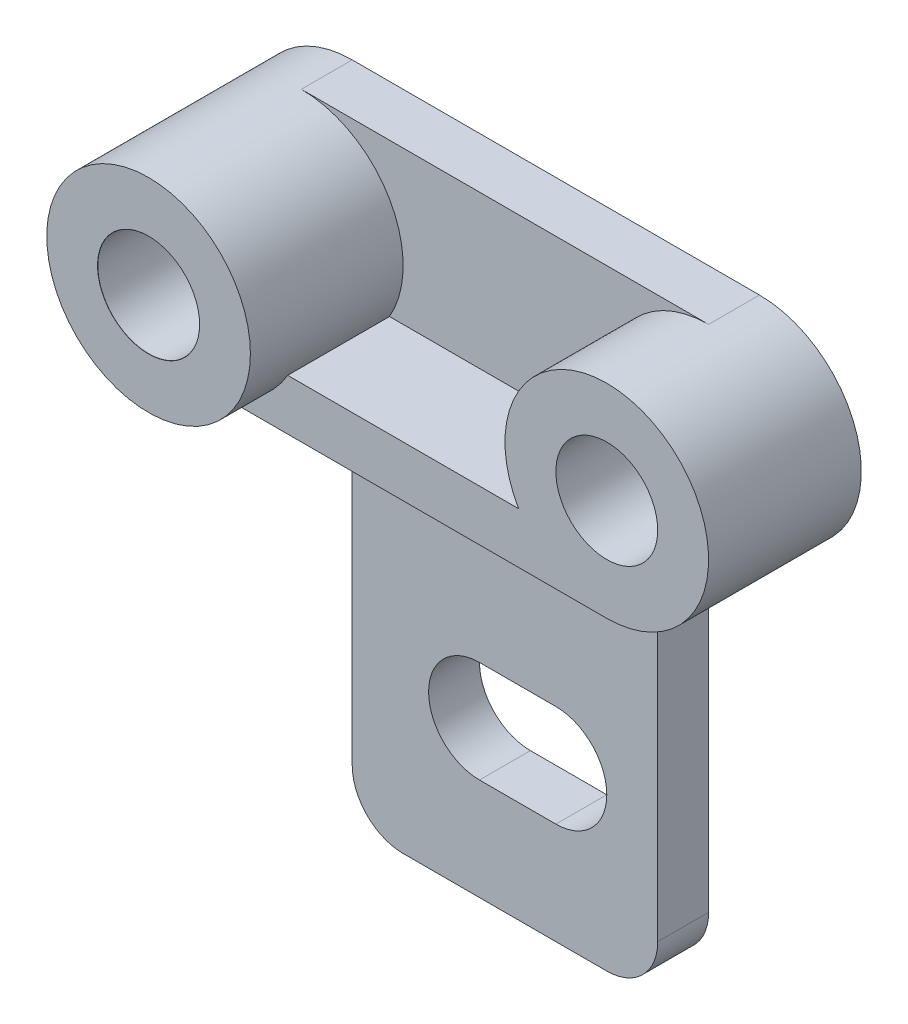
ISO-10303-21;
HEADER;
FILE_DESCRIPTION(('STEP AP214'),'2;1');
FILE_NAME('part.step','',(''),(''),'','','');
FILE_SCHEMA(('AUTOMOTIVE_DESIGN { 1 0 10303 214 1 1 1 1 }'));
ENDSEC;
DATA;
#1=APPLICATION_CONTEXT('core data for automotive mechanical design processes');
#2=APPLICATION_PROTOCOL_DEFINITION('international standard','automotive_design',2000,#1);
#3=PRODUCT_CONTEXT('',#1,'mechanical');
#4=PRODUCT('Part','Part','',(#3));
#5=PRODUCT_RELATED_PRODUCT_CATEGORY('part','',(#4));
#6=PRODUCT_DEFINITION_FORMATION('','',#4);
#7=PRODUCT_DEFINITION_CONTEXT('part definition',#1,'design');
#8=PRODUCT_DEFINITION('design','',#6,#7);
#9=PRODUCT_DEFINITION_SHAPE('','',#8);
#10=(LENGTH_UNIT() NAMED_UNIT(*) SI_UNIT(.MILLI.,.METRE.));
#11=(NAMED_UNIT(*) PLANE_ANGLE_UNIT() SI_UNIT($,.RADIAN.));
#12=(NAMED_UNIT(*) SI_UNIT($,.STERADIAN.) SOLID_ANGLE_UNIT());
#13=UNCERTAINTY_MEASURE_WITH_UNIT(LENGTH_MEASURE(1.E-05),#10,'distance_accuracy_value','');
#14=(GEOMETRIC_REPRESENTATION_CONTEXT(3) GLOBAL_UNCERTAINTY_ASSIGNED_CONTEXT((#13)) GLOBAL_UNIT_ASSIGNED_CONTEXT((#10,
#11,#12)) REPRESENTATION_CONTEXT('',''));
#15=CARTESIAN_POINT('',(0.,0.,0.));
#16=DIRECTION('',(0.,0.,1.));
#17=DIRECTION('',(1.,0.,0.));
#18=AXIS2_PLACEMENT_3D('',#15,#16,#17);
#19=CARTESIAN_POINT('',(-40.,0.,40.));
#20=DIRECTION('',(0.,0.,-1.));
#21=DIRECTION('',(-1.,0.,0.));
#22=AXIS2_PLACEMENT_3D('',#19,#20,#21);
#23=CYLINDRICAL_SURFACE('',#22,20.);
#24=CARTESIAN_POINT('',(-40.,0.,30.));
#25=DIRECTION('',(0.,0.,1.));
#26=DIRECTION('',(1.,0.,0.));
#27=AXIS2_PLACEMENT_3D('',#24,#25,#26);
#28=CIRCLE('',#27,20.);
#29=CARTESIAN_POINT('',(-40.,-20.,30.));
#30=VERTEX_POINT('',#29);
#31=CARTESIAN_POINT('',(-22.6794919243112,-9.99999999999999,30.));
#32=VERTEX_POINT('',#31);
#33=EDGE_CURVE('E292',#30,#32,#28,.T.);
#34=ORIENTED_EDGE('',*,*,#33,.T.);
#35=DIRECTION('',(0.,0.,-1.));
#36=VECTOR('',#35,1.);
#37=CARTESIAN_POINT('',(-22.6794919243112,-9.99999999999999,40.));
#38=LINE('',#37,#36);
#39=CARTESIAN_POINT('',(-22.6794919243112,-9.99999999999999,10.));
#40=VERTEX_POINT('',#39);
#41=EDGE_CURVE('E288',#32,#40,#38,.T.);
#42=ORIENTED_EDGE('',*,*,#41,.T.);
#43=CARTESIAN_POINT('',(-40.,0.,10.));
#44=DIRECTION('',(0.,0.,-1.));
#45=DIRECTION('',(-1.,0.,0.));
#46=AXIS2_PLACEMENT_3D('',#43,#44,#45);
#47=CIRCLE('',#46,20.);
#48=CARTESIAN_POINT('',(-40.,20.,10.));
#49=VERTEX_POINT('',#48);
#50=EDGE_CURVE('E54',#49,#40,#47,.T.);
#51=ORIENTED_EDGE('',*,*,#50,.F.);
#52=DIRECTION('',(0.,0.,-1.));
#53=VECTOR('',#52,1.);
#54=CARTESIAN_POINT('',(-40.,20.,10.));
#55=LINE('',#54,#53);
#56=CARTESIAN_POINT('',(-40.,20.,0.));
#57=VERTEX_POINT('',#56);
#58=EDGE_CURVE('E322',#49,#57,#55,.T.);
#59=ORIENTED_EDGE('',*,*,#58,.T.);
#60=CARTESIAN_POINT('',(-40.,0.,0.));
#61=DIRECTION('',(0.,0.,1.));
#62=DIRECTION('',(1.,0.,0.));
#63=AXIS2_PLACEMENT_3D('',#60,#61,#62);
#64=CIRCLE('',#63,20.);
#65=CARTESIAN_POINT('',(-40.,-20.,0.));
#66=VERTEX_POINT('',#65);
#67=EDGE_CURVE('E321',#57,#66,#64,.T.);
#68=ORIENTED_EDGE('',*,*,#67,.T.);
#69=DIRECTION('',(0.,0.,-1.));
#70=VECTOR('',#69,1.);
#71=CARTESIAN_POINT('',(-40.,-20.,10.));
#72=LINE('',#71,#70);
#73=EDGE_CURVE('E326',#30,#66,#72,.T.);
#74=ORIENTED_EDGE('',*,*,#73,.F.);
#75=EDGE_LOOP('',(#34,#42,#51,#59,#68,#74));
#76=FACE_BOUND('',#75,.T.);
#77=CARTESIAN_POINT('',(-40.,0.,40.));
#78=DIRECTION('',(0.,0.,1.));
#79=DIRECTION('',(1.,0.,0.));
#80=AXIS2_PLACEMENT_3D('',#77,#78,#79);
#81=CIRCLE('',#80,20.);
#82=CARTESIAN_POINT('',(-20.,0.,40.));
#83=VERTEX_POINT('',#82);
#84=EDGE_CURVE('E333',#83,#83,#81,.T.);
#85=ORIENTED_EDGE('',*,*,#84,.F.);
#86=EDGE_LOOP('',(#85));
#87=FACE_BOUND('',#86,.T.);
#88=ADVANCED_FACE('F45',(#76,#87),#23,.T.);
#89=CARTESIAN_POINT('',(-40.,0.,40.));
#90=DIRECTION('',(0.,0.,1.));
#91=DIRECTION('',(1.,0.,0.));
#92=AXIS2_PLACEMENT_3D('',#89,#90,#91);
#93=PLANE('',#92);
#94=CARTESIAN_POINT('',(-40.,0.,40.));
#95=DIRECTION('',(0.,0.,1.));
#96=DIRECTION('',(1.,0.,0.));
#97=AXIS2_PLACEMENT_3D('',#94,#95,#96);
#98=CIRCLE('',#97,10.025);
#99=CARTESIAN_POINT('',(-29.975,0.,40.));
#100=VERTEX_POINT('',#99);
#101=EDGE_CURVE('E464',#100,#100,#98,.T.);
#102=ORIENTED_EDGE('',*,*,#101,.F.);
#103=EDGE_LOOP('',(#102));
#104=FACE_BOUND('',#103,.T.);
#105=ORIENTED_EDGE('',*,*,#84,.T.);
#106=EDGE_LOOP('',(#105));
#107=FACE_BOUND('',#106,.T.);
#108=ADVANCED_FACE('F396',(#104,#107),#93,.T.);
#109=CARTESIAN_POINT('',(-40.,0.,0.));
#110=DIRECTION('',(0.,0.,1.));
#111=DIRECTION('',(1.,0.,0.));
#112=AXIS2_PLACEMENT_3D('',#109,#110,#111);
#113=PLANE('',#112);
#114=CARTESIAN_POINT('',(-40.,0.,0.));
#115=DIRECTION('',(0.,0.,1.));
#116=DIRECTION('',(1.,0.,0.));
#117=AXIS2_PLACEMENT_3D('',#114,#115,#116);
#118=CIRCLE('',#117,9.99999999999999);
#119=CARTESIAN_POINT('',(-30.,0.,0.));
#120=VERTEX_POINT('',#119);
#121=EDGE_CURVE('E468',#120,#120,#118,.T.);
#122=ORIENTED_EDGE('',*,*,#121,.T.);
#123=EDGE_LOOP('',(#122));
#124=FACE_BOUND('',#123,.T.);
#125=CARTESIAN_POINT('',(40.,0.,0.));
#126=DIRECTION('',(0.,0.,1.));
#127=DIRECTION('',(1.,0.,0.));
#128=AXIS2_PLACEMENT_3D('',#125,#126,#127);
#129=CIRCLE('',#128,9.99999999999999);
#130=CARTESIAN_POINT('',(50.,0.,0.));
#131=VERTEX_POINT('',#130);
#132=EDGE_CURVE('E187',#131,#131,#129,.T.);
#133=ORIENTED_EDGE('',*,*,#132,.T.);
#134=EDGE_LOOP('',(#133));
#135=FACE_BOUND('',#134,.T.);
#136=DIRECTION('',(-1.,0.,0.));
#137=VECTOR('',#136,1.);
#138=CARTESIAN_POINT('',(-5.,-60.,0.));
#139=LINE('',#138,#137);
#140=CARTESIAN_POINT('',(9.99999999999999,-60.,0.));
#141=VERTEX_POINT('',#140);
#142=CARTESIAN_POINT('',(-5.,-60.,0.));
#143=VERTEX_POINT('',#142);
#144=EDGE_CURVE('E168',#141,#143,#139,.T.);
#145=ORIENTED_EDGE('',*,*,#144,.T.);
#146=CARTESIAN_POINT('',(-5.,-70.,0.));
#147=DIRECTION('',(0.,0.,1.));
#148=DIRECTION('',(1.,0.,0.));
#149=AXIS2_PLACEMENT_3D('',#146,#147,#148);
#150=CIRCLE('',#149,10.);
#151=CARTESIAN_POINT('',(-5.,-80.,0.));
#152=VERTEX_POINT('',#151);
#153=EDGE_CURVE('E161',#143,#152,#150,.T.);
#154=ORIENTED_EDGE('',*,*,#153,.T.);
#155=DIRECTION('',(1.,0.,0.));
#156=VECTOR('',#155,1.);
#157=CARTESIAN_POINT('',(-5.,-80.,0.));
#158=LINE('',#157,#156);
#159=CARTESIAN_POINT('',(9.99999999999999,-80.,0.));
#160=VERTEX_POINT('',#159);
#161=EDGE_CURVE('E171',#152,#160,#158,.T.);
#162=ORIENTED_EDGE('',*,*,#161,.T.);
#163=CARTESIAN_POINT('',(9.99999999999999,-70.,0.));
#164=DIRECTION('',(0.,0.,1.));
#165=DIRECTION('',(1.,0.,0.));
#166=AXIS2_PLACEMENT_3D('',#163,#164,#165);
#167=CIRCLE('',#166,10.);
#168=EDGE_CURVE('E61',#160,#141,#167,.T.);
#169=ORIENTED_EDGE('',*,*,#168,.T.);
#170=EDGE_LOOP('',(#145,#154,#162,#169));
#171=FACE_BOUND('',#170,.T.);
#172=DIRECTION('',(-1.,0.,0.));
#173=VECTOR('',#172,1.);
#174=CARTESIAN_POINT('',(40.,-20.,0.));
#175=LINE('',#174,#173);
#176=CARTESIAN_POINT('',(40.,-20.,0.));
#177=VERTEX_POINT('',#176);
#178=CARTESIAN_POINT('',(30.,-20.,0.));
#179=VERTEX_POINT('',#178);
#180=EDGE_CURVE('E311',#177,#179,#175,.T.);
#181=ORIENTED_EDGE('',*,*,#180,.T.);
#182=DIRECTION('',(0.,-1.,0.));
#183=VECTOR('',#182,1.);
#184=CARTESIAN_POINT('',(30.,-20.,0.));
#185=LINE('',#184,#183);
#186=CARTESIAN_POINT('',(30.,-89.9999999999999,0.));
#187=VERTEX_POINT('',#186);
#188=EDGE_CURVE('E205',#179,#187,#185,.T.);
#189=ORIENTED_EDGE('',*,*,#188,.T.);
#190=CARTESIAN_POINT('',(20.,-90.,0.));
#191=DIRECTION('',(0.,0.,-1.));
#192=DIRECTION('',(-1.,0.,0.));
#193=AXIS2_PLACEMENT_3D('',#190,#191,#192);
#194=CIRCLE('',#193,10.);
#195=CARTESIAN_POINT('',(19.9999999999999,-100.,0.));
#196=VERTEX_POINT('',#195);
#197=EDGE_CURVE('E239',#187,#196,#194,.T.);
#198=ORIENTED_EDGE('',*,*,#197,.T.);
#199=DIRECTION('',(-1.,0.,0.));
#200=VECTOR('',#199,1.);
#201=CARTESIAN_POINT('',(19.9999999999999,-100.,0.));
#202=LINE('',#201,#200);
#203=CARTESIAN_POINT('',(-19.9999999999999,-100.,0.));
#204=VERTEX_POINT('',#203);
#205=EDGE_CURVE('E243',#196,#204,#202,.T.);
#206=ORIENTED_EDGE('',*,*,#205,.T.);
#207=CARTESIAN_POINT('',(-20.,-90.,0.));
#208=DIRECTION('',(0.,0.,-1.));
#209=DIRECTION('',(-1.,0.,0.));
#210=AXIS2_PLACEMENT_3D('',#207,#208,#209);
#211=CIRCLE('',#210,10.);
#212=CARTESIAN_POINT('',(-30.,-89.9999999999999,0.));
#213=VERTEX_POINT('',#212);
#214=EDGE_CURVE('E247',#204,#213,#211,.T.);
#215=ORIENTED_EDGE('',*,*,#214,.T.);
#216=DIRECTION('',(0.,1.,0.));
#217=VECTOR('',#216,1.);
#218=CARTESIAN_POINT('',(-30.,-20.,0.));
#219=LINE('',#218,#217);
#220=CARTESIAN_POINT('',(-30.,-20.,0.));
#221=VERTEX_POINT('',#220);
#222=EDGE_CURVE('E216',#213,#221,#219,.T.);
#223=ORIENTED_EDGE('',*,*,#222,.T.);
#224=EDGE_CURVE('E301',#221,#66,#175,.T.);
#225=ORIENTED_EDGE('',*,*,#224,.T.);
#226=ORIENTED_EDGE('',*,*,#67,.F.);
#227=DIRECTION('',(1.,0.,0.));
#228=VECTOR('',#227,1.);
#229=CARTESIAN_POINT('',(40.,20.,0.));
#230=LINE('',#229,#228);
#231=CARTESIAN_POINT('',(40.,20.,0.));
#232=VERTEX_POINT('',#231);
#233=EDGE_CURVE('E310',#57,#232,#230,.T.);
#234=ORIENTED_EDGE('',*,*,#233,.T.);
#235=CARTESIAN_POINT('',(40.,0.,0.));
#236=DIRECTION('',(0.,0.,1.));
#237=DIRECTION('',(1.,0.,0.));
#238=AXIS2_PLACEMENT_3D('',#235,#236,#237);
#239=CIRCLE('',#238,20.);
#240=EDGE_CURVE('E296',#177,#232,#239,.T.);
#241=ORIENTED_EDGE('',*,*,#240,.F.);
#242=EDGE_LOOP('',(#181,#189,#198,#206,#215,#223,#225,#226,#234,#241));
#243=FACE_BOUND('',#242,.T.);
#244=ADVANCED_FACE('F176',(#124,#135,#171,#243),#113,.F.);
#245=CARTESIAN_POINT('',(40.,20.,10.));
#246=DIRECTION('',(0.,1.,0.));
#247=DIRECTION('',(0.,0.,1.));
#248=AXIS2_PLACEMENT_3D('',#245,#246,#247);
#249=PLANE('',#248);
#250=ORIENTED_EDGE('',*,*,#233,.F.);
#251=ORIENTED_EDGE('',*,*,#58,.F.);
#252=DIRECTION('',(1.,0.,0.));
#253=VECTOR('',#252,1.);
#254=CARTESIAN_POINT('',(40.,20.,10.));
#255=LINE('',#254,#253);
#256=CARTESIAN_POINT('',(40.,20.,10.));
#257=VERTEX_POINT('',#256);
#258=EDGE_CURVE('E305',#49,#257,#255,.T.);
#259=ORIENTED_EDGE('',*,*,#258,.T.);
#260=DIRECTION('',(0.,0.,-1.));
#261=VECTOR('',#260,1.);
#262=CARTESIAN_POINT('',(40.,20.,10.));
#263=LINE('',#262,#261);
#264=EDGE_CURVE('E318',#257,#232,#263,.T.);
#265=ORIENTED_EDGE('',*,*,#264,.T.);
#266=EDGE_LOOP('',(#250,#251,#259,#265));
#267=FACE_BOUND('',#266,.T.);
#268=ADVANCED_FACE('F350',(#267),#249,.T.);
#269=CARTESIAN_POINT('',(40.,-20.,10.));
#270=DIRECTION('',(0.,-1.,0.));
#271=DIRECTION('',(0.,0.,-1.));
#272=AXIS2_PLACEMENT_3D('',#269,#270,#271);
#273=PLANE('',#272);
#274=DIRECTION('',(0.,0.,-1.));
#275=VECTOR('',#274,1.);
#276=CARTESIAN_POINT('',(30.,-20.,10.));
#277=LINE('',#276,#275);
#278=CARTESIAN_POINT('',(30.,-20.,10.));
#279=VERTEX_POINT('',#278);
#280=EDGE_CURVE('E253',#279,#179,#277,.T.);
#281=ORIENTED_EDGE('',*,*,#280,.T.);
#282=ORIENTED_EDGE('',*,*,#180,.F.);
#283=DIRECTION('',(0.,0.,-1.));
#284=VECTOR('',#283,1.);
#285=CARTESIAN_POINT('',(40.,-20.,10.));
#286=LINE('',#285,#284);
#287=CARTESIAN_POINT('',(40.,-20.,30.));
#288=VERTEX_POINT('',#287);
#289=EDGE_CURVE('E309',#288,#177,#286,.T.);
#290=ORIENTED_EDGE('',*,*,#289,.F.);
#291=DIRECTION('',(1.,0.,0.));
#292=VECTOR('',#291,1.);
#293=CARTESIAN_POINT('',(-40.,-20.,30.));
#294=LINE('',#293,#292);
#295=EDGE_CURVE('E257',#30,#288,#294,.T.);
#296=ORIENTED_EDGE('',*,*,#295,.F.);
#297=ORIENTED_EDGE('',*,*,#73,.T.);
#298=ORIENTED_EDGE('',*,*,#224,.F.);
#299=DIRECTION('',(0.,0.,-1.));
#300=VECTOR('',#299,1.);
#301=CARTESIAN_POINT('',(-30.,-20.,10.));
#302=LINE('',#301,#300);
#303=CARTESIAN_POINT('',(-30.,-20.,10.));
#304=VERTEX_POINT('',#303);
#305=EDGE_CURVE('E258',#304,#221,#302,.T.);
#306=ORIENTED_EDGE('',*,*,#305,.F.);
#307=DIRECTION('',(1.,0.,0.));
#308=VECTOR('',#307,1.);
#309=CARTESIAN_POINT('',(30.,-20.,10.));
#310=LINE('',#309,#308);
#311=EDGE_CURVE('E231',#304,#279,#310,.T.);
#312=ORIENTED_EDGE('',*,*,#311,.T.);
#313=EDGE_LOOP('',(#281,#282,#290,#296,#297,#298,#306,#312));
#314=FACE_BOUND('',#313,.T.);
#315=ADVANCED_FACE('F358',(#314),#273,.T.);
#316=CARTESIAN_POINT('',(0.,0.,10.));
#317=DIRECTION('',(0.,0.,-1.));
#318=DIRECTION('',(-1.,0.,0.));
#319=AXIS2_PLACEMENT_3D('',#316,#317,#318);
#320=PLANE('',#319);
#321=ORIENTED_EDGE('',*,*,#50,.T.);
#322=DIRECTION('',(1.,0.,0.));
#323=VECTOR('',#322,1.);
#324=CARTESIAN_POINT('',(0.,-9.99999999999999,10.));
#325=LINE('',#324,#323);
#326=CARTESIAN_POINT('',(22.6794919243112,-9.99999999999999,10.));
#327=VERTEX_POINT('',#326);
#328=EDGE_CURVE('E284',#40,#327,#325,.T.);
#329=ORIENTED_EDGE('',*,*,#328,.T.);
#330=CARTESIAN_POINT('',(40.,0.,10.));
#331=DIRECTION('',(0.,0.,-1.));
#332=DIRECTION('',(-1.,0.,0.));
#333=AXIS2_PLACEMENT_3D('',#330,#331,#332);
#334=CIRCLE('',#333,20.);
#335=EDGE_CURVE('E11',#257,#327,#334,.F.);
#336=ORIENTED_EDGE('',*,*,#335,.F.);
#337=ORIENTED_EDGE('',*,*,#258,.F.);
#338=EDGE_LOOP('',(#321,#329,#336,#337));
#339=FACE_BOUND('',#338,.T.);
#340=ADVANCED_FACE('F344',(#339),#320,.F.);
#341=CARTESIAN_POINT('',(40.,0.,30.));
#342=DIRECTION('',(0.,0.,-1.));
#343=DIRECTION('',(-1.,0.,0.));
#344=AXIS2_PLACEMENT_3D('',#341,#342,#343);
#345=CYLINDRICAL_SURFACE('',#344,20.);
#346=ORIENTED_EDGE('',*,*,#335,.T.);
#347=DIRECTION('',(0.,0.,-1.));
#348=VECTOR('',#347,1.);
#349=CARTESIAN_POINT('',(22.6794919243112,-9.99999999999999,30.));
#350=LINE('',#349,#348);
#351=CARTESIAN_POINT('',(22.6794919243112,-9.99999999999999,30.));
#352=VERTEX_POINT('',#351);
#353=EDGE_CURVE('E280',#327,#352,#350,.F.);
#354=ORIENTED_EDGE('',*,*,#353,.T.);
#355=CARTESIAN_POINT('',(40.,0.,30.));
#356=DIRECTION('',(0.,0.,1.));
#357=DIRECTION('',(1.,0.,0.));
#358=AXIS2_PLACEMENT_3D('',#355,#356,#357);
#359=CIRCLE('',#358,20.);
#360=EDGE_CURVE('E297',#288,#352,#359,.T.);
#361=ORIENTED_EDGE('',*,*,#360,.F.);
#362=ORIENTED_EDGE('',*,*,#289,.T.);
#363=ORIENTED_EDGE('',*,*,#240,.T.);
#364=ORIENTED_EDGE('',*,*,#264,.F.);
#365=EDGE_LOOP('',(#346,#354,#361,#362,#363,#364));
#366=FACE_BOUND('',#365,.T.);
#367=ADVANCED_FACE('F354',(#366),#345,.T.);
#368=CARTESIAN_POINT('',(40.,0.,30.));
#369=DIRECTION('',(0.,0.,1.));
#370=DIRECTION('',(1.,0.,0.));
#371=AXIS2_PLACEMENT_3D('',#368,#369,#370);
#372=PLANE('',#371);
#373=CARTESIAN_POINT('',(40.,0.,30.));
#374=DIRECTION('',(0.,0.,1.));
#375=DIRECTION('',(1.,0.,0.));
#376=AXIS2_PLACEMENT_3D('',#373,#374,#375);
#377=CIRCLE('',#376,10.);
#378=CARTESIAN_POINT('',(50.,0.,30.));
#379=VERTEX_POINT('',#378);
#380=EDGE_CURVE('E48',#379,#379,#377,.T.);
#381=ORIENTED_EDGE('',*,*,#380,.F.);
#382=EDGE_LOOP('',(#381));
#383=FACE_BOUND('',#382,.T.);
#384=ORIENTED_EDGE('',*,*,#360,.T.);
#385=DIRECTION('',(-1.,0.,0.));
#386=VECTOR('',#385,1.);
#387=CARTESIAN_POINT('',(-40.,-9.99999999999999,30.));
#388=LINE('',#387,#386);
#389=EDGE_CURVE('E276',#352,#32,#388,.T.);
#390=ORIENTED_EDGE('',*,*,#389,.T.);
#391=ORIENTED_EDGE('',*,*,#33,.F.);
#392=ORIENTED_EDGE('',*,*,#295,.T.);
#393=EDGE_LOOP('',(#384,#390,#391,#392));
#394=FACE_BOUND('',#393,.T.);
#395=ADVANCED_FACE('F361',(#383,#394),#372,.T.);
#396=CARTESIAN_POINT('',(-40.,-9.99999999999999,0.));
#397=DIRECTION('',(0.,1.,0.));
#398=DIRECTION('',(0.,0.,1.));
#399=AXIS2_PLACEMENT_3D('',#396,#397,#398);
#400=PLANE('',#399);
#401=ORIENTED_EDGE('',*,*,#41,.F.);
#402=ORIENTED_EDGE('',*,*,#389,.F.);
#403=ORIENTED_EDGE('',*,*,#353,.F.);
#404=ORIENTED_EDGE('',*,*,#328,.F.);
#405=EDGE_LOOP('',(#401,#402,#403,#404));
#406=FACE_BOUND('',#405,.T.);
#407=ADVANCED_FACE('F420',(#406),#400,.T.);
#408=CARTESIAN_POINT('',(30.,-20.,10.));
#409=DIRECTION('',(1.,0.,0.));
#410=DIRECTION('',(0.,1.,0.));
#411=AXIS2_PLACEMENT_3D('',#408,#409,#410);
#412=PLANE('',#411);
#413=ORIENTED_EDGE('',*,*,#188,.F.);
#414=ORIENTED_EDGE('',*,*,#280,.F.);
#415=DIRECTION('',(0.,-1.,0.));
#416=VECTOR('',#415,1.);
#417=CARTESIAN_POINT('',(30.,-20.,10.));
#418=LINE('',#417,#416);
#419=CARTESIAN_POINT('',(30.,-89.9999999999999,10.));
#420=VERTEX_POINT('',#419);
#421=EDGE_CURVE('E211',#279,#420,#418,.T.);
#422=ORIENTED_EDGE('',*,*,#421,.T.);
#423=DIRECTION('',(0.,0.,-1.));
#424=VECTOR('',#423,1.);
#425=CARTESIAN_POINT('',(30.,-89.9999999999999,10.));
#426=LINE('',#425,#424);
#427=EDGE_CURVE('E235',#420,#187,#426,.T.);
#428=ORIENTED_EDGE('',*,*,#427,.T.);
#429=EDGE_LOOP('',(#413,#414,#422,#428));
#430=FACE_BOUND('',#429,.T.);
#431=ADVANCED_FACE('F378',(#430),#412,.T.);
#432=CARTESIAN_POINT('',(-30.,-20.,10.));
#433=DIRECTION('',(-1.,0.,0.));
#434=DIRECTION('',(0.,-1.,0.));
#435=AXIS2_PLACEMENT_3D('',#432,#433,#434);
#436=PLANE('',#435);
#437=ORIENTED_EDGE('',*,*,#222,.F.);
#438=DIRECTION('',(0.,0.,-1.));
#439=VECTOR('',#438,1.);
#440=CARTESIAN_POINT('',(-30.,-89.9999999999999,10.));
#441=LINE('',#440,#439);
#442=CARTESIAN_POINT('',(-30.,-89.9999999999999,10.));
#443=VERTEX_POINT('',#442);
#444=EDGE_CURVE('E262',#443,#213,#441,.T.);
#445=ORIENTED_EDGE('',*,*,#444,.F.);
#446=DIRECTION('',(0.,1.,0.));
#447=VECTOR('',#446,1.);
#448=CARTESIAN_POINT('',(-30.,-20.,10.));
#449=LINE('',#448,#447);
#450=EDGE_CURVE('E228',#443,#304,#449,.T.);
#451=ORIENTED_EDGE('',*,*,#450,.T.);
#452=ORIENTED_EDGE('',*,*,#305,.T.);
#453=EDGE_LOOP('',(#437,#445,#451,#452));
#454=FACE_BOUND('',#453,.T.);
#455=ADVANCED_FACE('F368',(#454),#436,.T.);
#456=CARTESIAN_POINT('',(-20.,-90.,10.));
#457=DIRECTION('',(0.,0.,-1.));
#458=DIRECTION('',(-1.,0.,0.));
#459=AXIS2_PLACEMENT_3D('',#456,#457,#458);
#460=CYLINDRICAL_SURFACE('',#459,10.);
#461=ORIENTED_EDGE('',*,*,#214,.F.);
#462=DIRECTION('',(0.,0.,-1.));
#463=VECTOR('',#462,1.);
#464=CARTESIAN_POINT('',(-19.9999999999999,-100.,10.));
#465=LINE('',#464,#463);
#466=CARTESIAN_POINT('',(-19.9999999999999,-100.,10.));
#467=VERTEX_POINT('',#466);
#468=EDGE_CURVE('E265',#467,#204,#465,.T.);
#469=ORIENTED_EDGE('',*,*,#468,.F.);
#470=CARTESIAN_POINT('',(-20.,-90.,10.));
#471=DIRECTION('',(0.,0.,-1.));
#472=DIRECTION('',(-1.,0.,0.));
#473=AXIS2_PLACEMENT_3D('',#470,#471,#472);
#474=CIRCLE('',#473,10.);
#475=EDGE_CURVE('E224',#467,#443,#474,.T.);
#476=ORIENTED_EDGE('',*,*,#475,.T.);
#477=ORIENTED_EDGE('',*,*,#444,.T.);
#478=EDGE_LOOP('',(#461,#469,#476,#477));
#479=FACE_BOUND('',#478,.T.);
#480=ADVANCED_FACE('F386',(#479),#460,.T.);
#481=CARTESIAN_POINT('',(19.9999999999999,-100.,10.));
#482=DIRECTION('',(0.,-1.,0.));
#483=DIRECTION('',(0.,0.,-1.));
#484=AXIS2_PLACEMENT_3D('',#481,#482,#483);
#485=PLANE('',#484);
#486=ORIENTED_EDGE('',*,*,#205,.F.);
#487=DIRECTION('',(0.,0.,-1.));
#488=VECTOR('',#487,1.);
#489=CARTESIAN_POINT('',(19.9999999999999,-100.,10.));
#490=LINE('',#489,#488);
#491=CARTESIAN_POINT('',(19.9999999999999,-100.,10.));
#492=VERTEX_POINT('',#491);
#493=EDGE_CURVE('E268',#492,#196,#490,.T.);
#494=ORIENTED_EDGE('',*,*,#493,.F.);
#495=DIRECTION('',(-1.,0.,0.));
#496=VECTOR('',#495,1.);
#497=CARTESIAN_POINT('',(19.9999999999999,-100.,10.));
#498=LINE('',#497,#496);
#499=EDGE_CURVE('E220',#492,#467,#498,.T.);
#500=ORIENTED_EDGE('',*,*,#499,.T.);
#501=ORIENTED_EDGE('',*,*,#468,.T.);
#502=EDGE_LOOP('',(#486,#494,#500,#501));
#503=FACE_BOUND('',#502,.T.);
#504=ADVANCED_FACE('F384',(#503),#485,.T.);
#505=CARTESIAN_POINT('',(20.,-90.,10.));
#506=DIRECTION('',(0.,0.,-1.));
#507=DIRECTION('',(-1.,0.,0.));
#508=AXIS2_PLACEMENT_3D('',#505,#506,#507);
#509=CYLINDRICAL_SURFACE('',#508,10.);
#510=ORIENTED_EDGE('',*,*,#197,.F.);
#511=ORIENTED_EDGE('',*,*,#427,.F.);
#512=CARTESIAN_POINT('',(20.,-90.,10.));
#513=DIRECTION('',(0.,0.,-1.));
#514=DIRECTION('',(-1.,0.,0.));
#515=AXIS2_PLACEMENT_3D('',#512,#513,#514);
#516=CIRCLE('',#515,10.);
#517=EDGE_CURVE('E215',#420,#492,#516,.T.);
#518=ORIENTED_EDGE('',*,*,#517,.T.);
#519=ORIENTED_EDGE('',*,*,#493,.T.);
#520=EDGE_LOOP('',(#510,#511,#518,#519));
#521=FACE_BOUND('',#520,.T.);
#522=ADVANCED_FACE('F380',(#521),#509,.T.);
#523=CARTESIAN_POINT('',(20.,-90.,10.));
#524=DIRECTION('',(0.,0.,-1.));
#525=DIRECTION('',(-1.,0.,0.));
#526=AXIS2_PLACEMENT_3D('',#523,#524,#525);
#527=PLANE('',#526);
#528=DIRECTION('',(1.,0.,0.));
#529=VECTOR('',#528,1.);
#530=CARTESIAN_POINT('',(-5.,-80.,10.));
#531=LINE('',#530,#529);
#532=CARTESIAN_POINT('',(-5.,-80.,10.));
#533=VERTEX_POINT('',#532);
#534=CARTESIAN_POINT('',(9.99999999999999,-80.,10.));
#535=VERTEX_POINT('',#534);
#536=EDGE_CURVE('E196',#533,#535,#531,.T.);
#537=ORIENTED_EDGE('',*,*,#536,.F.);
#538=CARTESIAN_POINT('',(-5.,-70.,10.));
#539=DIRECTION('',(0.,0.,1.));
#540=DIRECTION('',(1.,0.,0.));
#541=AXIS2_PLACEMENT_3D('',#538,#539,#540);
#542=CIRCLE('',#541,10.);
#543=CARTESIAN_POINT('',(-5.,-60.,10.));
#544=VERTEX_POINT('',#543);
#545=EDGE_CURVE('E69',#544,#533,#542,.T.);
#546=ORIENTED_EDGE('',*,*,#545,.F.);
#547=DIRECTION('',(-1.,0.,0.));
#548=VECTOR('',#547,1.);
#549=CARTESIAN_POINT('',(-5.,-60.,10.));
#550=LINE('',#549,#548);
#551=CARTESIAN_POINT('',(9.99999999999999,-60.,10.));
#552=VERTEX_POINT('',#551);
#553=EDGE_CURVE('E180',#552,#544,#550,.T.);
#554=ORIENTED_EDGE('',*,*,#553,.F.);
#555=CARTESIAN_POINT('',(9.99999999999999,-70.,10.));
#556=DIRECTION('',(0.,0.,1.));
#557=DIRECTION('',(1.,0.,0.));
#558=AXIS2_PLACEMENT_3D('',#555,#556,#557);
#559=CIRCLE('',#558,10.);
#560=EDGE_CURVE('E184',#535,#552,#559,.T.);
#561=ORIENTED_EDGE('',*,*,#560,.F.);
#562=EDGE_LOOP('',(#537,#546,#554,#561));
#563=FACE_BOUND('',#562,.T.);
#564=ORIENTED_EDGE('',*,*,#421,.F.);
#565=ORIENTED_EDGE('',*,*,#311,.F.);
#566=ORIENTED_EDGE('',*,*,#450,.F.);
#567=ORIENTED_EDGE('',*,*,#475,.F.);
#568=ORIENTED_EDGE('',*,*,#499,.F.);
#569=ORIENTED_EDGE('',*,*,#517,.F.);
#570=EDGE_LOOP('',(#564,#565,#566,#567,#568,#569));
#571=FACE_BOUND('',#570,.T.);
#572=ADVANCED_FACE('F374',(#563,#571),#527,.F.);
#573=CARTESIAN_POINT('',(-5.,-70.,0.));
#574=DIRECTION('',(0.,0.,1.));
#575=DIRECTION('',(1.,0.,0.));
#576=AXIS2_PLACEMENT_3D('',#573,#574,#575);
#577=CYLINDRICAL_SURFACE('',#576,10.);
#578=ORIENTED_EDGE('',*,*,#545,.T.);
#579=DIRECTION('',(0.,0.,1.));
#580=VECTOR('',#579,1.);
#581=CARTESIAN_POINT('',(-5.,-80.,0.));
#582=LINE('',#581,#580);
#583=EDGE_CURVE('E157',#152,#533,#582,.T.);
#584=ORIENTED_EDGE('',*,*,#583,.F.);
#585=ORIENTED_EDGE('',*,*,#153,.F.);
#586=DIRECTION('',(0.,0.,1.));
#587=VECTOR('',#586,1.);
#588=CARTESIAN_POINT('',(-5.,-60.,0.));
#589=LINE('',#588,#587);
#590=EDGE_CURVE('E202',#143,#544,#589,.T.);
#591=ORIENTED_EDGE('',*,*,#590,.T.);
#592=EDGE_LOOP('',(#578,#584,#585,#591));
#593=FACE_BOUND('',#592,.T.);
#594=ADVANCED_FACE('F159',(#593),#577,.F.);
#595=CARTESIAN_POINT('',(-5.,-60.,0.));
#596=DIRECTION('',(0.,1.,0.));
#597=DIRECTION('',(0.,0.,1.));
#598=AXIS2_PLACEMENT_3D('',#595,#596,#597);
#599=PLANE('',#598);
#600=ORIENTED_EDGE('',*,*,#553,.T.);
#601=ORIENTED_EDGE('',*,*,#590,.F.);
#602=ORIENTED_EDGE('',*,*,#144,.F.);
#603=DIRECTION('',(0.,0.,1.));
#604=VECTOR('',#603,1.);
#605=CARTESIAN_POINT('',(9.99999999999999,-60.,0.));
#606=LINE('',#605,#604);
#607=EDGE_CURVE('E206',#141,#552,#606,.T.);
#608=ORIENTED_EDGE('',*,*,#607,.T.);
#609=EDGE_LOOP('',(#600,#601,#602,#608));
#610=FACE_BOUND('',#609,.T.);
#611=ADVANCED_FACE('F436',(#610),#599,.F.);
#612=CARTESIAN_POINT('',(9.99999999999999,-70.,0.));
#613=DIRECTION('',(0.,0.,1.));
#614=DIRECTION('',(1.,0.,0.));
#615=AXIS2_PLACEMENT_3D('',#612,#613,#614);
#616=CYLINDRICAL_SURFACE('',#615,10.);
#617=ORIENTED_EDGE('',*,*,#560,.T.);
#618=ORIENTED_EDGE('',*,*,#607,.F.);
#619=ORIENTED_EDGE('',*,*,#168,.F.);
#620=DIRECTION('',(0.,0.,1.));
#621=VECTOR('',#620,1.);
#622=CARTESIAN_POINT('',(9.99999999999999,-80.,0.));
#623=LINE('',#622,#621);
#624=EDGE_CURVE('E167',#160,#535,#623,.T.);
#625=ORIENTED_EDGE('',*,*,#624,.T.);
#626=EDGE_LOOP('',(#617,#618,#619,#625));
#627=FACE_BOUND('',#626,.T.);
#628=ADVANCED_FACE('F441',(#627),#616,.F.);
#629=CARTESIAN_POINT('',(-5.,-80.,0.));
#630=DIRECTION('',(0.,-1.,0.));
#631=DIRECTION('',(0.,0.,-1.));
#632=AXIS2_PLACEMENT_3D('',#629,#630,#631);
#633=PLANE('',#632);
#634=ORIENTED_EDGE('',*,*,#536,.T.);
#635=ORIENTED_EDGE('',*,*,#624,.F.);
#636=ORIENTED_EDGE('',*,*,#161,.F.);
#637=ORIENTED_EDGE('',*,*,#583,.T.);
#638=EDGE_LOOP('',(#634,#635,#636,#637));
#639=FACE_BOUND('',#638,.T.);
#640=ADVANCED_FACE('F172',(#639),#633,.F.);
#641=CARTESIAN_POINT('',(40.,0.,40.));
#642=DIRECTION('',(0.,0.,1.));
#643=DIRECTION('',(1.,0.,0.));
#644=AXIS2_PLACEMENT_3D('',#641,#642,#643);
#645=CYLINDRICAL_SURFACE('',#644,10.);
#646=ORIENTED_EDGE('',*,*,#380,.T.);
#647=EDGE_LOOP('',(#646));
#648=FACE_BOUND('',#647,.T.);
#649=ORIENTED_EDGE('',*,*,#132,.F.);
#650=EDGE_LOOP('',(#649));
#651=FACE_BOUND('',#650,.T.);
#652=ADVANCED_FACE('F440',(#648,#651),#645,.F.);
#653=CARTESIAN_POINT('',(-40.,0.,40.));
#654=DIRECTION('',(0.,0.,1.));
#655=DIRECTION('',(1.,0.,0.));
#656=AXIS2_PLACEMENT_3D('',#653,#654,#655);
#657=CYLINDRICAL_SURFACE('',#656,10.);
#658=ORIENTED_EDGE('',*,*,#121,.F.);
#659=EDGE_LOOP('',(#658));
#660=FACE_BOUND('',#659,.T.);
#661=CARTESIAN_POINT('',(-40.,0.,39.9790225092206));
#662=DIRECTION('',(0.,0.,1.));
#663=DIRECTION('',(1.,0.,0.));
#664=AXIS2_PLACEMENT_3D('',#661,#662,#663);
#665=CIRCLE('',#664,10.);
#666=CARTESIAN_POINT('',(-30.,0.,39.9790225092206));
#667=VERTEX_POINT('',#666);
#668=EDGE_CURVE('E462',#667,#667,#665,.T.);
#669=ORIENTED_EDGE('',*,*,#668,.T.);
#670=EDGE_LOOP('',(#669));
#671=FACE_BOUND('',#670,.T.);
#672=ADVANCED_FACE('F449',(#660,#671),#657,.F.);
#673=CARTESIAN_POINT('',(-40.,0.,40.));
#674=DIRECTION('',(0.,0.,1.));
#675=DIRECTION('',(1.,0.,0.));
#676=AXIS2_PLACEMENT_3D('',#673,#674,#675);
#677=CONICAL_SURFACE('',#676,10.025,0.872664625996846);
#678=ORIENTED_EDGE('',*,*,#668,.F.);
#679=EDGE_LOOP('',(#678));
#680=FACE_BOUND('',#679,.T.);
#681=ORIENTED_EDGE('',*,*,#101,.T.);
#682=EDGE_LOOP('',(#681));
#683=FACE_BOUND('',#682,.T.);
#684=ADVANCED_FACE('F453',(#680,#683),#677,.F.);
#685=CLOSED_SHELL('',(#88,#108,#244,#268,#315,#340,#367,#395,#407,#431,#455,#480,#504,#522,#572,
#594,#611,#628,#640,#652,#672,#684));
#686=MANIFOLD_SOLID_BREP('B2',#685);
#687=ADVANCED_BREP_SHAPE_REPRESENTATION('',(#18,#686),#14);
#688=SHAPE_DEFINITION_REPRESENTATION(#9,#687);
ENDSEC;
END-ISO-10303-21;
